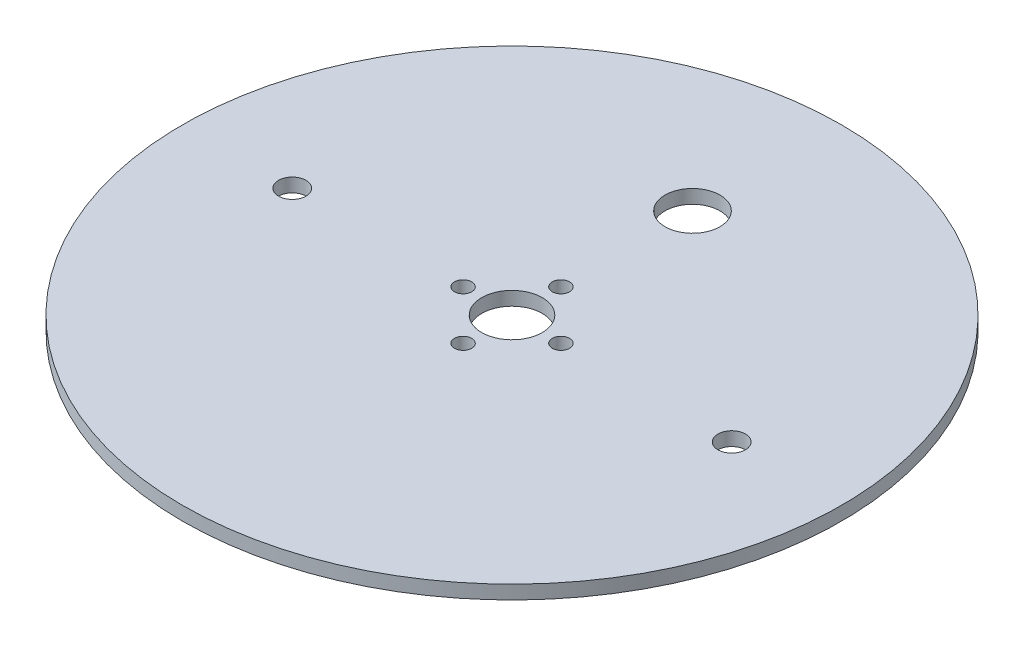
ISO-10303-21;
HEADER;
FILE_DESCRIPTION(('STEP AP214'),'2;1');
FILE_NAME('part.step','',(''),(''),'','','');
FILE_SCHEMA(('AUTOMOTIVE_DESIGN { 1 0 10303 214 1 1 1 1 }'));
ENDSEC;
DATA;
#1=APPLICATION_CONTEXT('core data for automotive mechanical design processes');
#2=APPLICATION_PROTOCOL_DEFINITION('international standard','automotive_design',2000,#1);
#3=PRODUCT_CONTEXT('',#1,'mechanical');
#4=PRODUCT('Part','Part','',(#3));
#5=PRODUCT_RELATED_PRODUCT_CATEGORY('part','',(#4));
#6=PRODUCT_DEFINITION_FORMATION('','',#4);
#7=PRODUCT_DEFINITION_CONTEXT('part definition',#1,'design');
#8=PRODUCT_DEFINITION('design','',#6,#7);
#9=PRODUCT_DEFINITION_SHAPE('','',#8);
#10=(LENGTH_UNIT() NAMED_UNIT(*) SI_UNIT(.MILLI.,.METRE.));
#11=(NAMED_UNIT(*) PLANE_ANGLE_UNIT() SI_UNIT($,.RADIAN.));
#12=(NAMED_UNIT(*) SI_UNIT($,.STERADIAN.) SOLID_ANGLE_UNIT());
#13=UNCERTAINTY_MEASURE_WITH_UNIT(LENGTH_MEASURE(1.E-05),#10,'distance_accuracy_value','');
#14=(GEOMETRIC_REPRESENTATION_CONTEXT(3) GLOBAL_UNCERTAINTY_ASSIGNED_CONTEXT((#13)) GLOBAL_UNIT_ASSIGNED_CONTEXT((#10,
#11,#12)) REPRESENTATION_CONTEXT('',''));
#15=CARTESIAN_POINT('',(0.,0.,0.));
#16=DIRECTION('',(0.,0.,1.));
#17=DIRECTION('',(1.,0.,0.));
#18=AXIS2_PLACEMENT_3D('',#15,#16,#17);
#19=CARTESIAN_POINT('',(0.,3.175,0.));
#20=DIRECTION('',(0.,-1.,0.));
#21=DIRECTION('',(0.,0.,-1.));
#22=AXIS2_PLACEMENT_3D('',#19,#20,#21);
#23=CYLINDRICAL_SURFACE('',#22,76.2);
#24=CARTESIAN_POINT('',(0.,3.175,0.));
#25=DIRECTION('',(0.,1.,0.));
#26=DIRECTION('',(0.,0.,1.));
#27=AXIS2_PLACEMENT_3D('',#24,#25,#26);
#28=CIRCLE('',#27,76.2);
#29=CARTESIAN_POINT('',(0.,3.175,76.2));
#30=VERTEX_POINT('',#29);
#31=EDGE_CURVE('E10',#30,#30,#28,.T.);
#32=ORIENTED_EDGE('',*,*,#31,.F.);
#33=EDGE_LOOP('',(#32));
#34=FACE_BOUND('',#33,.T.);
#35=CARTESIAN_POINT('',(0.,0.,0.));
#36=DIRECTION('',(0.,1.,0.));
#37=DIRECTION('',(0.,0.,1.));
#38=AXIS2_PLACEMENT_3D('',#35,#36,#37);
#39=CIRCLE('',#38,76.2);
#40=CARTESIAN_POINT('',(0.,0.,76.2));
#41=VERTEX_POINT('',#40);
#42=EDGE_CURVE('E34',#41,#41,#39,.T.);
#43=ORIENTED_EDGE('',*,*,#42,.T.);
#44=EDGE_LOOP('',(#43));
#45=FACE_BOUND('',#44,.T.);
#46=ADVANCED_FACE('F31',(#34,#45),#23,.T.);
#47=CARTESIAN_POINT('',(0.,3.175,0.));
#48=DIRECTION('',(0.,1.,0.));
#49=DIRECTION('',(0.,0.,1.));
#50=AXIS2_PLACEMENT_3D('',#47,#48,#49);
#51=PLANE('',#50);
#52=CARTESIAN_POINT('',(0.,3.175,-41.7338254403277));
#53=DIRECTION('',(0.,1.,0.));
#54=DIRECTION('',(0.,0.,1.));
#55=AXIS2_PLACEMENT_3D('',#52,#53,#54);
#56=CIRCLE('',#55,6.35);
#57=CARTESIAN_POINT('',(0.,3.175,-35.3838254403277));
#58=VERTEX_POINT('',#57);
#59=EDGE_CURVE('E87',#58,#58,#56,.T.);
#60=ORIENTED_EDGE('',*,*,#59,.F.);
#61=EDGE_LOOP('',(#60));
#62=FACE_BOUND('',#61,.T.);
#63=CARTESIAN_POINT('',(-50.8,3.175,0.));
#64=DIRECTION('',(0.,-1.,0.));
#65=DIRECTION('',(0.,0.,-1.));
#66=AXIS2_PLACEMENT_3D('',#63,#64,#65);
#67=CIRCLE('',#66,3.17499999999998);
#68=CARTESIAN_POINT('',(-50.8,3.175,-3.17499999999999));
#69=VERTEX_POINT('',#68);
#70=EDGE_CURVE('E53',#69,#69,#67,.T.);
#71=ORIENTED_EDGE('',*,*,#70,.T.);
#72=EDGE_LOOP('',(#71));
#73=FACE_BOUND('',#72,.T.);
#74=CARTESIAN_POINT('',(50.8,3.175,0.));
#75=DIRECTION('',(0.,-1.,0.));
#76=DIRECTION('',(0.,0.,-1.));
#77=AXIS2_PLACEMENT_3D('',#74,#75,#76);
#78=CIRCLE('',#77,3.17499999999998);
#79=CARTESIAN_POINT('',(50.8,3.175,-3.17499999999996));
#80=VERTEX_POINT('',#79);
#81=EDGE_CURVE('E76',#80,#80,#78,.T.);
#82=ORIENTED_EDGE('',*,*,#81,.T.);
#83=EDGE_LOOP('',(#82));
#84=FACE_BOUND('',#83,.T.);
#85=CARTESIAN_POINT('',(11.314,3.175,0.));
#86=DIRECTION('',(0.,1.,0.));
#87=DIRECTION('',(0.,0.,1.));
#88=AXIS2_PLACEMENT_3D('',#85,#86,#87);
#89=CIRCLE('',#88,2.);
#90=CARTESIAN_POINT('',(11.314,3.175,2.));
#91=VERTEX_POINT('',#90);
#92=EDGE_CURVE('E68',#91,#91,#89,.T.);
#93=ORIENTED_EDGE('',*,*,#92,.F.);
#94=EDGE_LOOP('',(#93));
#95=FACE_BOUND('',#94,.T.);
#96=CARTESIAN_POINT('',(0.,3.175,11.314));
#97=DIRECTION('',(0.,1.,0.));
#98=DIRECTION('',(0.,0.,1.));
#99=AXIS2_PLACEMENT_3D('',#96,#97,#98);
#100=CIRCLE('',#99,2.);
#101=CARTESIAN_POINT('',(0.,3.175,13.314));
#102=VERTEX_POINT('',#101);
#103=EDGE_CURVE('E62',#102,#102,#100,.T.);
#104=ORIENTED_EDGE('',*,*,#103,.F.);
#105=EDGE_LOOP('',(#104));
#106=FACE_BOUND('',#105,.T.);
#107=CARTESIAN_POINT('',(-11.314,3.175,0.));
#108=DIRECTION('',(0.,1.,0.));
#109=DIRECTION('',(0.,0.,1.));
#110=AXIS2_PLACEMENT_3D('',#107,#108,#109);
#111=CIRCLE('',#110,2.);
#112=CARTESIAN_POINT('',(-11.314,3.175,1.99999999999992));
#113=VERTEX_POINT('',#112);
#114=EDGE_CURVE('E56',#113,#113,#111,.T.);
#115=ORIENTED_EDGE('',*,*,#114,.F.);
#116=EDGE_LOOP('',(#115));
#117=FACE_BOUND('',#116,.T.);
#118=CARTESIAN_POINT('',(1.18507859603014E-13,3.175,-11.314));
#119=DIRECTION('',(0.,1.,0.));
#120=DIRECTION('',(0.,0.,1.));
#121=AXIS2_PLACEMENT_3D('',#118,#119,#120);
#122=CIRCLE('',#121,2.);
#123=CARTESIAN_POINT('',(1.18507859603014E-13,3.175,-9.314));
#124=VERTEX_POINT('',#123);
#125=EDGE_CURVE('E49',#124,#124,#122,.T.);
#126=ORIENTED_EDGE('',*,*,#125,.F.);
#127=EDGE_LOOP('',(#126));
#128=FACE_BOUND('',#127,.T.);
#129=CARTESIAN_POINT('',(0.,3.175,0.));
#130=DIRECTION('',(0.,1.,0.));
#131=DIRECTION('',(0.,0.,1.));
#132=AXIS2_PLACEMENT_3D('',#129,#130,#131);
#133=CIRCLE('',#132,7.);
#134=CARTESIAN_POINT('',(0.,3.175,7.));
#135=VERTEX_POINT('',#134);
#136=EDGE_CURVE('E43',#135,#135,#133,.T.);
#137=ORIENTED_EDGE('',*,*,#136,.F.);
#138=EDGE_LOOP('',(#137));
#139=FACE_BOUND('',#138,.T.);
#140=ORIENTED_EDGE('',*,*,#31,.T.);
#141=EDGE_LOOP('',(#140));
#142=FACE_BOUND('',#141,.T.);
#143=ADVANCED_FACE('F94',(#62,#73,#84,#95,#106,#117,#128,#139,#142),#51,.T.);
#144=CARTESIAN_POINT('',(0.,0.,0.));
#145=DIRECTION('',(0.,1.,0.));
#146=DIRECTION('',(0.,0.,1.));
#147=AXIS2_PLACEMENT_3D('',#144,#145,#146);
#148=PLANE('',#147);
#149=CARTESIAN_POINT('',(0.,0.,-41.7338254403277));
#150=DIRECTION('',(0.,1.,0.));
#151=DIRECTION('',(0.,0.,1.));
#152=AXIS2_PLACEMENT_3D('',#149,#150,#151);
#153=CIRCLE('',#152,6.35);
#154=CARTESIAN_POINT('',(0.,0.,-35.3838254403277));
#155=VERTEX_POINT('',#154);
#156=EDGE_CURVE('E77',#155,#155,#153,.F.);
#157=ORIENTED_EDGE('',*,*,#156,.F.);
#158=EDGE_LOOP('',(#157));
#159=FACE_BOUND('',#158,.T.);
#160=CARTESIAN_POINT('',(-50.8,0.,0.));
#161=DIRECTION('',(0.,-1.,0.));
#162=DIRECTION('',(0.,0.,-1.));
#163=AXIS2_PLACEMENT_3D('',#160,#161,#162);
#164=CIRCLE('',#163,3.17499999999998);
#165=CARTESIAN_POINT('',(-50.8,0.,-3.17499999999999));
#166=VERTEX_POINT('',#165);
#167=EDGE_CURVE('E80',#166,#166,#164,.T.);
#168=ORIENTED_EDGE('',*,*,#167,.F.);
#169=EDGE_LOOP('',(#168));
#170=FACE_BOUND('',#169,.T.);
#171=CARTESIAN_POINT('',(50.8,0.,0.));
#172=DIRECTION('',(0.,-1.,0.));
#173=DIRECTION('',(0.,0.,-1.));
#174=AXIS2_PLACEMENT_3D('',#171,#172,#173);
#175=CIRCLE('',#174,3.17499999999998);
#176=CARTESIAN_POINT('',(50.8,0.,-3.17499999999996));
#177=VERTEX_POINT('',#176);
#178=EDGE_CURVE('E73',#177,#177,#175,.T.);
#179=ORIENTED_EDGE('',*,*,#178,.F.);
#180=EDGE_LOOP('',(#179));
#181=FACE_BOUND('',#180,.T.);
#182=CARTESIAN_POINT('',(11.314,0.,0.));
#183=DIRECTION('',(0.,1.,0.));
#184=DIRECTION('',(0.,0.,1.));
#185=AXIS2_PLACEMENT_3D('',#182,#183,#184);
#186=CIRCLE('',#185,2.);
#187=CARTESIAN_POINT('',(11.314,0.,2.));
#188=VERTEX_POINT('',#187);
#189=EDGE_CURVE('E46',#188,#188,#186,.T.);
#190=ORIENTED_EDGE('',*,*,#189,.T.);
#191=EDGE_LOOP('',(#190));
#192=FACE_BOUND('',#191,.T.);
#193=CARTESIAN_POINT('',(0.,0.,11.314));
#194=DIRECTION('',(0.,1.,0.));
#195=DIRECTION('',(0.,0.,1.));
#196=AXIS2_PLACEMENT_3D('',#193,#194,#195);
#197=CIRCLE('',#196,2.);
#198=CARTESIAN_POINT('',(0.,0.,13.314));
#199=VERTEX_POINT('',#198);
#200=EDGE_CURVE('E65',#199,#199,#197,.T.);
#201=ORIENTED_EDGE('',*,*,#200,.T.);
#202=EDGE_LOOP('',(#201));
#203=FACE_BOUND('',#202,.T.);
#204=CARTESIAN_POINT('',(-11.314,0.,0.));
#205=DIRECTION('',(0.,1.,0.));
#206=DIRECTION('',(0.,0.,1.));
#207=AXIS2_PLACEMENT_3D('',#204,#205,#206);
#208=CIRCLE('',#207,2.);
#209=CARTESIAN_POINT('',(-11.314,0.,1.99999999999992));
#210=VERTEX_POINT('',#209);
#211=EDGE_CURVE('E59',#210,#210,#208,.T.);
#212=ORIENTED_EDGE('',*,*,#211,.T.);
#213=EDGE_LOOP('',(#212));
#214=FACE_BOUND('',#213,.T.);
#215=CARTESIAN_POINT('',(1.18507859603014E-13,0.,-11.314));
#216=DIRECTION('',(0.,1.,0.));
#217=DIRECTION('',(0.,0.,1.));
#218=AXIS2_PLACEMENT_3D('',#215,#216,#217);
#219=CIRCLE('',#218,2.);
#220=CARTESIAN_POINT('',(1.18507859603014E-13,0.,-9.314));
#221=VERTEX_POINT('',#220);
#222=EDGE_CURVE('E52',#221,#221,#219,.T.);
#223=ORIENTED_EDGE('',*,*,#222,.T.);
#224=EDGE_LOOP('',(#223));
#225=FACE_BOUND('',#224,.T.);
#226=CARTESIAN_POINT('',(0.,0.,0.));
#227=DIRECTION('',(0.,1.,0.));
#228=DIRECTION('',(0.,0.,1.));
#229=AXIS2_PLACEMENT_3D('',#226,#227,#228);
#230=CIRCLE('',#229,7.);
#231=CARTESIAN_POINT('',(0.,0.,7.));
#232=VERTEX_POINT('',#231);
#233=EDGE_CURVE('E41',#232,#232,#230,.T.);
#234=ORIENTED_EDGE('',*,*,#233,.T.);
#235=EDGE_LOOP('',(#234));
#236=FACE_BOUND('',#235,.T.);
#237=ORIENTED_EDGE('',*,*,#42,.F.);
#238=EDGE_LOOP('',(#237));
#239=FACE_BOUND('',#238,.T.);
#240=ADVANCED_FACE('F97',(#159,#170,#181,#192,#203,#214,#225,#236,#239),#148,.F.);
#241=CARTESIAN_POINT('',(0.,0.,0.));
#242=DIRECTION('',(0.,1.,0.));
#243=DIRECTION('',(0.,0.,1.));
#244=AXIS2_PLACEMENT_3D('',#241,#242,#243);
#245=CYLINDRICAL_SURFACE('',#244,7.);
#246=ORIENTED_EDGE('',*,*,#233,.F.);
#247=EDGE_LOOP('',(#246));
#248=FACE_BOUND('',#247,.T.);
#249=ORIENTED_EDGE('',*,*,#136,.T.);
#250=EDGE_LOOP('',(#249));
#251=FACE_BOUND('',#250,.T.);
#252=ADVANCED_FACE('F113',(#248,#251),#245,.F.);
#253=CARTESIAN_POINT('',(1.18507859603014E-13,0.,-11.314));
#254=DIRECTION('',(0.,1.,0.));
#255=DIRECTION('',(0.,0.,1.));
#256=AXIS2_PLACEMENT_3D('',#253,#254,#255);
#257=CYLINDRICAL_SURFACE('',#256,2.);
#258=ORIENTED_EDGE('',*,*,#222,.F.);
#259=EDGE_LOOP('',(#258));
#260=FACE_BOUND('',#259,.T.);
#261=ORIENTED_EDGE('',*,*,#125,.T.);
#262=EDGE_LOOP('',(#261));
#263=FACE_BOUND('',#262,.T.);
#264=ADVANCED_FACE('F115',(#260,#263),#257,.F.);
#265=CARTESIAN_POINT('',(-11.314,0.,0.));
#266=DIRECTION('',(0.,1.,0.));
#267=DIRECTION('',(0.,0.,1.));
#268=AXIS2_PLACEMENT_3D('',#265,#266,#267);
#269=CYLINDRICAL_SURFACE('',#268,2.);
#270=ORIENTED_EDGE('',*,*,#211,.F.);
#271=EDGE_LOOP('',(#270));
#272=FACE_BOUND('',#271,.T.);
#273=ORIENTED_EDGE('',*,*,#114,.T.);
#274=EDGE_LOOP('',(#273));
#275=FACE_BOUND('',#274,.T.);
#276=ADVANCED_FACE('F122',(#272,#275),#269,.F.);
#277=CARTESIAN_POINT('',(0.,0.,11.314));
#278=DIRECTION('',(0.,1.,0.));
#279=DIRECTION('',(0.,0.,1.));
#280=AXIS2_PLACEMENT_3D('',#277,#278,#279);
#281=CYLINDRICAL_SURFACE('',#280,2.);
#282=ORIENTED_EDGE('',*,*,#200,.F.);
#283=EDGE_LOOP('',(#282));
#284=FACE_BOUND('',#283,.T.);
#285=ORIENTED_EDGE('',*,*,#103,.T.);
#286=EDGE_LOOP('',(#285));
#287=FACE_BOUND('',#286,.T.);
#288=ADVANCED_FACE('F178',(#284,#287),#281,.F.);
#289=CARTESIAN_POINT('',(11.314,0.,0.));
#290=DIRECTION('',(0.,1.,0.));
#291=DIRECTION('',(0.,0.,1.));
#292=AXIS2_PLACEMENT_3D('',#289,#290,#291);
#293=CYLINDRICAL_SURFACE('',#292,2.);
#294=ORIENTED_EDGE('',*,*,#189,.F.);
#295=EDGE_LOOP('',(#294));
#296=FACE_BOUND('',#295,.T.);
#297=ORIENTED_EDGE('',*,*,#92,.T.);
#298=EDGE_LOOP('',(#297));
#299=FACE_BOUND('',#298,.T.);
#300=ADVANCED_FACE('F170',(#296,#299),#293,.F.);
#301=CARTESIAN_POINT('',(50.8,3.175,0.));
#302=DIRECTION('',(0.,-1.,0.));
#303=DIRECTION('',(0.,0.,-1.));
#304=AXIS2_PLACEMENT_3D('',#301,#302,#303);
#305=CYLINDRICAL_SURFACE('',#304,3.17499999999998);
#306=ORIENTED_EDGE('',*,*,#81,.F.);
#307=EDGE_LOOP('',(#306));
#308=FACE_BOUND('',#307,.T.);
#309=ORIENTED_EDGE('',*,*,#178,.T.);
#310=EDGE_LOOP('',(#309));
#311=FACE_BOUND('',#310,.T.);
#312=ADVANCED_FACE('F163',(#308,#311),#305,.F.);
#313=CARTESIAN_POINT('',(-50.8,3.175,0.));
#314=DIRECTION('',(0.,-1.,0.));
#315=DIRECTION('',(0.,0.,-1.));
#316=AXIS2_PLACEMENT_3D('',#313,#314,#315);
#317=CYLINDRICAL_SURFACE('',#316,3.17499999999998);
#318=ORIENTED_EDGE('',*,*,#70,.F.);
#319=EDGE_LOOP('',(#318));
#320=FACE_BOUND('',#319,.T.);
#321=ORIENTED_EDGE('',*,*,#167,.T.);
#322=EDGE_LOOP('',(#321));
#323=FACE_BOUND('',#322,.T.);
#324=ADVANCED_FACE('F154',(#320,#323),#317,.F.);
#325=CARTESIAN_POINT('',(0.,-0.00100000000000013,-41.7338254403277));
#326=DIRECTION('',(0.,1.,0.));
#327=DIRECTION('',(0.,0.,1.));
#328=AXIS2_PLACEMENT_3D('',#325,#326,#327);
#329=CYLINDRICAL_SURFACE('',#328,6.35);
#330=ORIENTED_EDGE('',*,*,#59,.T.);
#331=EDGE_LOOP('',(#330));
#332=FACE_BOUND('',#331,.T.);
#333=ORIENTED_EDGE('',*,*,#156,.T.);
#334=EDGE_LOOP('',(#333));
#335=FACE_BOUND('',#334,.T.);
#336=ADVANCED_FACE('F91',(#332,#335),#329,.F.);
#337=CLOSED_SHELL('',(#46,#143,#240,#252,#264,#276,#288,#300,#312,#324,#336));
#338=MANIFOLD_SOLID_BREP('B2',#337);
#339=ADVANCED_BREP_SHAPE_REPRESENTATION('',(#18,#338),#14);
#340=SHAPE_DEFINITION_REPRESENTATION(#9,#339);
ENDSEC;
END-ISO-10303-21;
